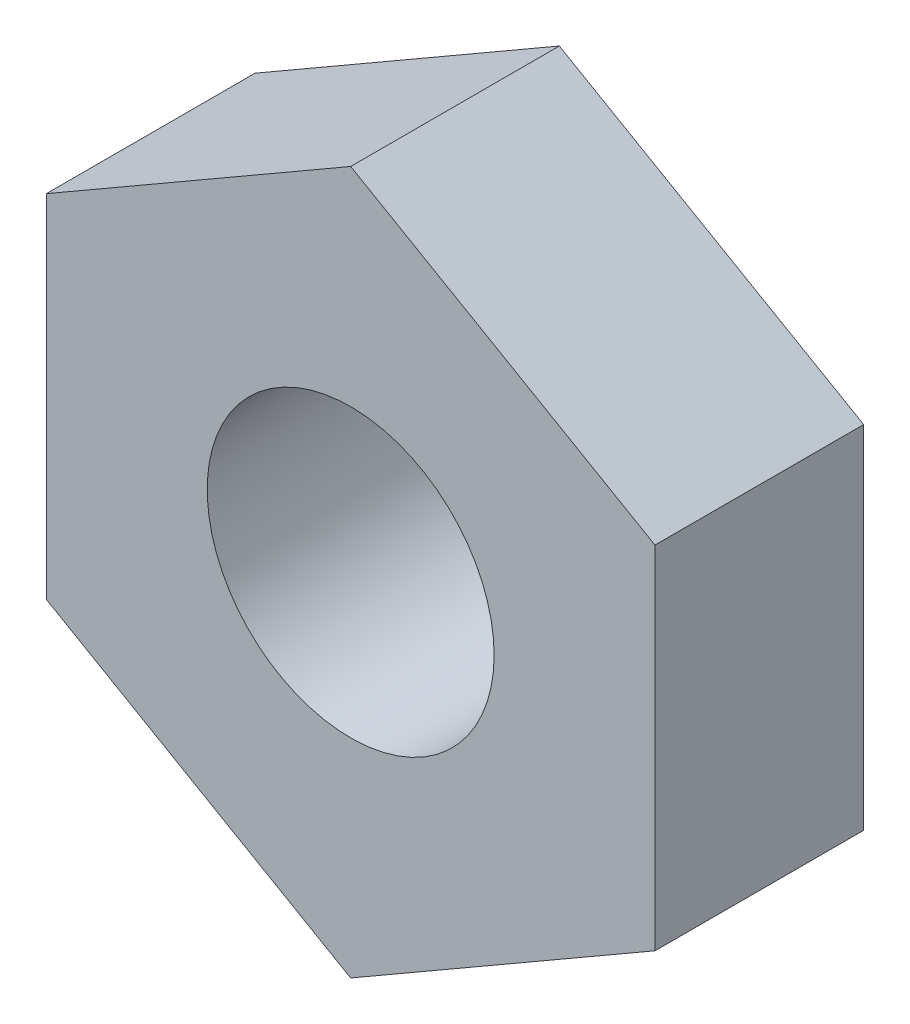
ISO-10303-21;
HEADER;
FILE_DESCRIPTION(('STEP AP214'),'2;1');
FILE_NAME('part.step','',(''),(''),'','','');
FILE_SCHEMA(('AUTOMOTIVE_DESIGN { 1 0 10303 214 1 1 1 1 }'));
ENDSEC;
DATA;
#1=APPLICATION_CONTEXT('core data for automotive mechanical design processes');
#2=APPLICATION_PROTOCOL_DEFINITION('international standard','automotive_design',2000,#1);
#3=PRODUCT_CONTEXT('',#1,'mechanical');
#4=PRODUCT('Part','Part','',(#3));
#5=PRODUCT_RELATED_PRODUCT_CATEGORY('part','',(#4));
#6=PRODUCT_DEFINITION_FORMATION('','',#4);
#7=PRODUCT_DEFINITION_CONTEXT('part definition',#1,'design');
#8=PRODUCT_DEFINITION('design','',#6,#7);
#9=PRODUCT_DEFINITION_SHAPE('','',#8);
#10=(LENGTH_UNIT() NAMED_UNIT(*) SI_UNIT(.MILLI.,.METRE.));
#11=(NAMED_UNIT(*) PLANE_ANGLE_UNIT() SI_UNIT($,.RADIAN.));
#12=(NAMED_UNIT(*) SI_UNIT($,.STERADIAN.) SOLID_ANGLE_UNIT());
#13=UNCERTAINTY_MEASURE_WITH_UNIT(LENGTH_MEASURE(1.E-05),#10,'distance_accuracy_value','');
#14=(GEOMETRIC_REPRESENTATION_CONTEXT(3) GLOBAL_UNCERTAINTY_ASSIGNED_CONTEXT((#13)) GLOBAL_UNIT_ASSIGNED_CONTEXT((#10,
#11,#12)) REPRESENTATION_CONTEXT('',''));
#15=CARTESIAN_POINT('',(0.,0.,0.));
#16=DIRECTION('',(0.,0.,1.));
#17=DIRECTION('',(1.,0.,0.));
#18=AXIS2_PLACEMENT_3D('',#15,#16,#17);
#19=CARTESIAN_POINT('',(0.,4.04145188432738,0.));
#20=DIRECTION('',(0.,0.,-1.));
#21=DIRECTION('',(-1.,0.,0.));
#22=AXIS2_PLACEMENT_3D('',#19,#20,#21);
#23=PLANE('',#22);
#24=DIRECTION('',(0.,1.,0.));
#25=VECTOR('',#24,1.);
#26=CARTESIAN_POINT('',(-3.5,2.02072594216368,0.));
#27=LINE('',#26,#25);
#28=CARTESIAN_POINT('',(-3.5,-2.0207259421637,0.));
#29=VERTEX_POINT('',#28);
#30=CARTESIAN_POINT('',(-3.5,2.02072594216368,0.));
#31=VERTEX_POINT('',#30);
#32=EDGE_CURVE('E103',#29,#31,#27,.T.);
#33=ORIENTED_EDGE('',*,*,#32,.F.);
#34=DIRECTION('',(0.866025403784438,-0.5,0.));
#35=VECTOR('',#34,1.);
#36=CARTESIAN_POINT('',(-3.5,-2.0207259421637,0.));
#37=LINE('',#36,#35);
#38=CARTESIAN_POINT('',(0.,-4.0414518843274,0.));
#39=VERTEX_POINT('',#38);
#40=EDGE_CURVE('E111',#39,#29,#37,.F.);
#41=ORIENTED_EDGE('',*,*,#40,.F.);
#42=DIRECTION('',(0.866025403784438,0.5,0.));
#43=VECTOR('',#42,1.);
#44=CARTESIAN_POINT('',(0.,-4.0414518843274,0.));
#45=LINE('',#44,#43);
#46=CARTESIAN_POINT('',(3.5,-2.0207259421637,0.));
#47=VERTEX_POINT('',#46);
#48=EDGE_CURVE('E116',#47,#39,#45,.F.);
#49=ORIENTED_EDGE('',*,*,#48,.F.);
#50=DIRECTION('',(0.,1.,0.));
#51=VECTOR('',#50,1.);
#52=CARTESIAN_POINT('',(3.5,2.02072594216368,0.));
#53=LINE('',#52,#51);
#54=CARTESIAN_POINT('',(3.5,2.02072594216368,0.));
#55=VERTEX_POINT('',#54);
#56=EDGE_CURVE('E76',#47,#55,#53,.T.);
#57=ORIENTED_EDGE('',*,*,#56,.T.);
#58=DIRECTION('',(-0.866025403784437,0.5,0.));
#59=VECTOR('',#58,1.);
#60=CARTESIAN_POINT('',(3.5,2.02072594216368,0.));
#61=LINE('',#60,#59);
#62=CARTESIAN_POINT('',(0.,4.04145188432738,0.));
#63=VERTEX_POINT('',#62);
#64=EDGE_CURVE('E68',#63,#55,#61,.F.);
#65=ORIENTED_EDGE('',*,*,#64,.F.);
#66=DIRECTION('',(-0.866025403784438,-0.5,0.));
#67=VECTOR('',#66,1.);
#68=CARTESIAN_POINT('',(0.,4.04145188432738,0.));
#69=LINE('',#68,#67);
#70=EDGE_CURVE('E73',#31,#63,#69,.F.);
#71=ORIENTED_EDGE('',*,*,#70,.F.);
#72=EDGE_LOOP('',(#33,#41,#49,#57,#65,#71));
#73=FACE_BOUND('',#72,.T.);
#74=CARTESIAN_POINT('',(0.,0.,0.));
#75=DIRECTION('',(0.,0.,1.));
#76=DIRECTION('',(1.,0.,0.));
#77=AXIS2_PLACEMENT_3D('',#74,#75,#76);
#78=CIRCLE('',#77,1.65);
#79=CARTESIAN_POINT('',(1.65,0.,0.));
#80=VERTEX_POINT('',#79);
#81=EDGE_CURVE('E20',#80,#80,#78,.F.);
#82=ORIENTED_EDGE('',*,*,#81,.T.);
#83=EDGE_LOOP('',(#82));
#84=FACE_BOUND('',#83,.T.);
#85=ADVANCED_FACE('F17',(#73,#84),#23,.F.);
#86=CARTESIAN_POINT('',(0.,0.,-2.4));
#87=DIRECTION('',(0.,0.,1.));
#88=DIRECTION('',(1.,0.,0.));
#89=AXIS2_PLACEMENT_3D('',#86,#87,#88);
#90=CYLINDRICAL_SURFACE('',#89,1.65);
#91=ORIENTED_EDGE('',*,*,#81,.F.);
#92=EDGE_LOOP('',(#91));
#93=FACE_BOUND('',#92,.T.);
#94=CARTESIAN_POINT('',(0.,0.,-2.4));
#95=DIRECTION('',(0.,0.,1.));
#96=DIRECTION('',(1.,0.,0.));
#97=AXIS2_PLACEMENT_3D('',#94,#95,#96);
#98=CIRCLE('',#97,1.65);
#99=CARTESIAN_POINT('',(1.65,0.,-2.4));
#100=VERTEX_POINT('',#99);
#101=EDGE_CURVE('E95',#100,#100,#98,.T.);
#102=ORIENTED_EDGE('',*,*,#101,.F.);
#103=EDGE_LOOP('',(#102));
#104=FACE_BOUND('',#103,.T.);
#105=ADVANCED_FACE('F154',(#93,#104),#90,.F.);
#106=CARTESIAN_POINT('',(0.,4.04145188432738,-2.4));
#107=DIRECTION('',(-0.5,0.866025403784438,0.));
#108=DIRECTION('',(-0.866025403784438,-0.5,0.));
#109=AXIS2_PLACEMENT_3D('',#106,#107,#108);
#110=PLANE('',#109);
#111=DIRECTION('',(0.866025403784438,0.5,0.));
#112=VECTOR('',#111,1.);
#113=CARTESIAN_POINT('',(-3.5,2.02072594216368,-2.4));
#114=LINE('',#113,#112);
#115=CARTESIAN_POINT('',(-3.5,2.02072594216368,-2.4));
#116=VERTEX_POINT('',#115);
#117=CARTESIAN_POINT('',(0.,4.04145188432738,-2.4));
#118=VERTEX_POINT('',#117);
#119=EDGE_CURVE('E97',#116,#118,#114,.T.);
#120=ORIENTED_EDGE('',*,*,#119,.F.);
#121=DIRECTION('',(0.,0.,1.));
#122=VECTOR('',#121,1.);
#123=CARTESIAN_POINT('',(-3.5,2.02072594216368,-2.4));
#124=LINE('',#123,#122);
#125=EDGE_CURVE('E84',#31,#116,#124,.F.);
#126=ORIENTED_EDGE('',*,*,#125,.F.);
#127=ORIENTED_EDGE('',*,*,#70,.T.);
#128=DIRECTION('',(0.,0.,1.));
#129=VECTOR('',#128,1.);
#130=CARTESIAN_POINT('',(0.,4.04145188432739,-2.4));
#131=LINE('',#130,#129);
#132=EDGE_CURVE('E78',#118,#63,#131,.T.);
#133=ORIENTED_EDGE('',*,*,#132,.F.);
#134=EDGE_LOOP('',(#120,#126,#127,#133));
#135=FACE_BOUND('',#134,.T.);
#136=ADVANCED_FACE('F81',(#135),#110,.T.);
#137=CARTESIAN_POINT('',(3.5,2.02072594216368,-2.4));
#138=DIRECTION('',(0.5,0.866025403784437,0.));
#139=DIRECTION('',(-0.866025403784437,0.5,0.));
#140=AXIS2_PLACEMENT_3D('',#137,#138,#139);
#141=PLANE('',#140);
#142=DIRECTION('',(0.866025403784438,-0.5,0.));
#143=VECTOR('',#142,1.);
#144=CARTESIAN_POINT('',(0.,4.04145188432738,-2.4));
#145=LINE('',#144,#143);
#146=CARTESIAN_POINT('',(3.5,2.02072594216368,-2.4));
#147=VERTEX_POINT('',#146);
#148=EDGE_CURVE('E89',#118,#147,#145,.T.);
#149=ORIENTED_EDGE('',*,*,#148,.F.);
#150=ORIENTED_EDGE('',*,*,#132,.T.);
#151=ORIENTED_EDGE('',*,*,#64,.T.);
#152=DIRECTION('',(0.,0.,1.));
#153=VECTOR('',#152,1.);
#154=CARTESIAN_POINT('',(3.5,2.02072594216368,-2.4));
#155=LINE('',#154,#153);
#156=EDGE_CURVE('E91',#55,#147,#155,.F.);
#157=ORIENTED_EDGE('',*,*,#156,.T.);
#158=EDGE_LOOP('',(#149,#150,#151,#157));
#159=FACE_BOUND('',#158,.T.);
#160=ADVANCED_FACE('F87',(#159),#141,.T.);
#161=CARTESIAN_POINT('',(3.5,2.02072594216368,-2.4));
#162=DIRECTION('',(-1.,0.,0.));
#163=DIRECTION('',(0.,0.,1.));
#164=AXIS2_PLACEMENT_3D('',#161,#162,#163);
#165=PLANE('',#164);
#166=DIRECTION('',(0.,0.,1.));
#167=VECTOR('',#166,1.);
#168=CARTESIAN_POINT('',(3.5,-2.0207259421637,-2.4));
#169=LINE('',#168,#167);
#170=CARTESIAN_POINT('',(3.5,-2.0207259421637,-2.4));
#171=VERTEX_POINT('',#170);
#172=EDGE_CURVE('E113',#171,#47,#169,.T.);
#173=ORIENTED_EDGE('',*,*,#172,.F.);
#174=DIRECTION('',(0.,1.,0.));
#175=VECTOR('',#174,1.);
#176=CARTESIAN_POINT('',(3.5,4.04145188432738,-2.4));
#177=LINE('',#176,#175);
#178=EDGE_CURVE('E130',#147,#171,#177,.F.);
#179=ORIENTED_EDGE('',*,*,#178,.F.);
#180=ORIENTED_EDGE('',*,*,#156,.F.);
#181=ORIENTED_EDGE('',*,*,#56,.F.);
#182=EDGE_LOOP('',(#173,#179,#180,#181));
#183=FACE_BOUND('',#182,.T.);
#184=ADVANCED_FACE('F147',(#183),#165,.F.);
#185=CARTESIAN_POINT('',(0.,-4.0414518843274,-2.4));
#186=DIRECTION('',(0.5,-0.866025403784438,0.));
#187=DIRECTION('',(0.866025403784438,0.5,0.));
#188=AXIS2_PLACEMENT_3D('',#185,#186,#187);
#189=PLANE('',#188);
#190=DIRECTION('',(-0.866025403784438,-0.5,0.));
#191=VECTOR('',#190,1.);
#192=CARTESIAN_POINT('',(3.5,-2.0207259421637,-2.4));
#193=LINE('',#192,#191);
#194=CARTESIAN_POINT('',(0.,-4.0414518843274,-2.4));
#195=VERTEX_POINT('',#194);
#196=EDGE_CURVE('E125',#171,#195,#193,.T.);
#197=ORIENTED_EDGE('',*,*,#196,.F.);
#198=ORIENTED_EDGE('',*,*,#172,.T.);
#199=ORIENTED_EDGE('',*,*,#48,.T.);
#200=DIRECTION('',(0.,0.,1.));
#201=VECTOR('',#200,1.);
#202=CARTESIAN_POINT('',(0.,-4.0414518843274,-2.4));
#203=LINE('',#202,#201);
#204=EDGE_CURVE('E108',#195,#39,#203,.T.);
#205=ORIENTED_EDGE('',*,*,#204,.F.);
#206=EDGE_LOOP('',(#197,#198,#199,#205));
#207=FACE_BOUND('',#206,.T.);
#208=ADVANCED_FACE('F120',(#207),#189,.T.);
#209=CARTESIAN_POINT('',(-3.5,-2.0207259421637,-2.4));
#210=DIRECTION('',(-0.5,-0.866025403784438,0.));
#211=DIRECTION('',(0.866025403784438,-0.5,0.));
#212=AXIS2_PLACEMENT_3D('',#209,#210,#211);
#213=PLANE('',#212);
#214=DIRECTION('',(-0.866025403784438,0.5,0.));
#215=VECTOR('',#214,1.);
#216=CARTESIAN_POINT('',(0.,-4.0414518843274,-2.4));
#217=LINE('',#216,#215);
#218=CARTESIAN_POINT('',(-3.5,-2.0207259421637,-2.4));
#219=VERTEX_POINT('',#218);
#220=EDGE_CURVE('E26',#195,#219,#217,.T.);
#221=ORIENTED_EDGE('',*,*,#220,.F.);
#222=ORIENTED_EDGE('',*,*,#204,.T.);
#223=ORIENTED_EDGE('',*,*,#40,.T.);
#224=DIRECTION('',(0.,0.,1.));
#225=VECTOR('',#224,1.);
#226=CARTESIAN_POINT('',(-3.5,-2.0207259421637,-2.4));
#227=LINE('',#226,#225);
#228=EDGE_CURVE('E35',#219,#29,#227,.T.);
#229=ORIENTED_EDGE('',*,*,#228,.F.);
#230=EDGE_LOOP('',(#221,#222,#223,#229));
#231=FACE_BOUND('',#230,.T.);
#232=ADVANCED_FACE('F121',(#231),#213,.T.);
#233=CARTESIAN_POINT('',(-3.5,2.02072594216368,-2.4));
#234=DIRECTION('',(-1.,0.,0.));
#235=DIRECTION('',(0.,0.,1.));
#236=AXIS2_PLACEMENT_3D('',#233,#234,#235);
#237=PLANE('',#236);
#238=DIRECTION('',(0.,1.,0.));
#239=VECTOR('',#238,1.);
#240=CARTESIAN_POINT('',(-3.5,4.04145188432738,-2.4));
#241=LINE('',#240,#239);
#242=EDGE_CURVE('E11',#219,#116,#241,.T.);
#243=ORIENTED_EDGE('',*,*,#242,.F.);
#244=ORIENTED_EDGE('',*,*,#228,.T.);
#245=ORIENTED_EDGE('',*,*,#32,.T.);
#246=ORIENTED_EDGE('',*,*,#125,.T.);
#247=EDGE_LOOP('',(#243,#244,#245,#246));
#248=FACE_BOUND('',#247,.T.);
#249=ADVANCED_FACE('F133',(#248),#237,.T.);
#250=CARTESIAN_POINT('',(0.,4.04145188432738,-2.4));
#251=DIRECTION('',(0.,0.,-1.));
#252=DIRECTION('',(-1.,0.,0.));
#253=AXIS2_PLACEMENT_3D('',#250,#251,#252);
#254=PLANE('',#253);
#255=ORIENTED_EDGE('',*,*,#220,.T.);
#256=ORIENTED_EDGE('',*,*,#242,.T.);
#257=ORIENTED_EDGE('',*,*,#119,.T.);
#258=ORIENTED_EDGE('',*,*,#148,.T.);
#259=ORIENTED_EDGE('',*,*,#178,.T.);
#260=ORIENTED_EDGE('',*,*,#196,.T.);
#261=EDGE_LOOP('',(#255,#256,#257,#258,#259,#260));
#262=FACE_BOUND('',#261,.T.);
#263=ORIENTED_EDGE('',*,*,#101,.T.);
#264=EDGE_LOOP('',(#263));
#265=FACE_BOUND('',#264,.T.);
#266=ADVANCED_FACE('F128',(#262,#265),#254,.T.);
#267=CLOSED_SHELL('',(#85,#105,#136,#160,#184,#208,#232,#249,#266));
#268=MANIFOLD_SOLID_BREP('B1',#267);
#269=ADVANCED_BREP_SHAPE_REPRESENTATION('',(#18,#268),#14);
#270=SHAPE_DEFINITION_REPRESENTATION(#9,#269);
ENDSEC;
END-ISO-10303-21;
